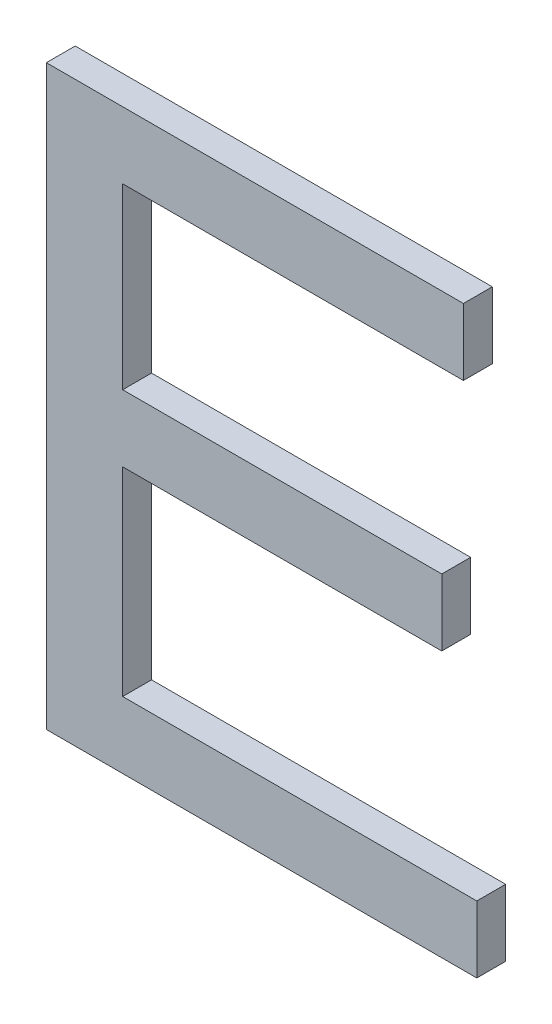
ISO-10303-21;
HEADER;
FILE_DESCRIPTION(('STEP AP214'),'2;1');
FILE_NAME('part.step','',(''),(''),'','','');
FILE_SCHEMA(('AUTOMOTIVE_DESIGN { 1 0 10303 214 1 1 1 1 }'));
ENDSEC;
DATA;
#1=APPLICATION_CONTEXT('core data for automotive mechanical design processes');
#2=APPLICATION_PROTOCOL_DEFINITION('international standard','automotive_design',2000,#1);
#3=PRODUCT_CONTEXT('',#1,'mechanical');
#4=PRODUCT('Part','Part','',(#3));
#5=PRODUCT_RELATED_PRODUCT_CATEGORY('part','',(#4));
#6=PRODUCT_DEFINITION_FORMATION('','',#4);
#7=PRODUCT_DEFINITION_CONTEXT('part definition',#1,'design');
#8=PRODUCT_DEFINITION('design','',#6,#7);
#9=PRODUCT_DEFINITION_SHAPE('','',#8);
#10=(LENGTH_UNIT() NAMED_UNIT(*) SI_UNIT(.MILLI.,.METRE.));
#11=(NAMED_UNIT(*) PLANE_ANGLE_UNIT() SI_UNIT($,.RADIAN.));
#12=(NAMED_UNIT(*) SI_UNIT($,.STERADIAN.) SOLID_ANGLE_UNIT());
#13=UNCERTAINTY_MEASURE_WITH_UNIT(LENGTH_MEASURE(1.E-05),#10,'distance_accuracy_value','');
#14=(GEOMETRIC_REPRESENTATION_CONTEXT(3) GLOBAL_UNCERTAINTY_ASSIGNED_CONTEXT((#13)) GLOBAL_UNIT_ASSIGNED_CONTEXT((#10,
#11,#12)) REPRESENTATION_CONTEXT('',''));
#15=CARTESIAN_POINT('',(0.,0.,0.));
#16=DIRECTION('',(0.,0.,1.));
#17=DIRECTION('',(1.,0.,0.));
#18=AXIS2_PLACEMENT_3D('',#15,#16,#17);
#19=CARTESIAN_POINT('',(0.319625251833,0.499859494143,0.05));
#20=DIRECTION('',(0.,0.,1.));
#21=DIRECTION('',(1.,0.,0.));
#22=AXIS2_PLACEMENT_3D('',#19,#20,#21);
#23=PLANE('',#22);
#24=DIRECTION('',(0.,1.,0.));
#25=VECTOR('',#24,1.);
#26=CARTESIAN_POINT('',(0.,0.,0.05));
#27=LINE('',#26,#25);
#28=CARTESIAN_POINT('',(0.,0.,0.05));
#29=VERTEX_POINT('',#28);
#30=CARTESIAN_POINT('',(0.,1.,0.05));
#31=VERTEX_POINT('',#30);
#32=EDGE_CURVE('E21',#29,#31,#27,.T.);
#33=ORIENTED_EDGE('',*,*,#32,.F.);
#34=DIRECTION('',(-1.,0.,0.));
#35=VECTOR('',#34,1.);
#36=CARTESIAN_POINT('',(0.745367005814,0.,0.05));
#37=LINE('',#36,#35);
#38=CARTESIAN_POINT('',(0.745367005814,0.,0.05));
#39=VERTEX_POINT('',#38);
#40=EDGE_CURVE('E190',#39,#29,#37,.T.);
#41=ORIENTED_EDGE('',*,*,#40,.F.);
#42=DIRECTION('',(0.,-1.,0.));
#43=VECTOR('',#42,1.);
#44=CARTESIAN_POINT('',(0.745367005814,0.115552325581,0.05));
#45=LINE('',#44,#43);
#46=CARTESIAN_POINT('',(0.745367005814,0.115552325581,0.05));
#47=VERTEX_POINT('',#46);
#48=EDGE_CURVE('E177',#47,#39,#45,.T.);
#49=ORIENTED_EDGE('',*,*,#48,.F.);
#50=DIRECTION('',(1.,0.,0.));
#51=VECTOR('',#50,1.);
#52=CARTESIAN_POINT('',(0.132176598837,0.115552325581,0.05));
#53=LINE('',#52,#51);
#54=CARTESIAN_POINT('',(0.132176598837,0.115552325581,0.05));
#55=VERTEX_POINT('',#54);
#56=EDGE_CURVE('E166',#55,#47,#53,.T.);
#57=ORIENTED_EDGE('',*,*,#56,.F.);
#58=DIRECTION('',(0.,-1.,0.));
#59=VECTOR('',#58,1.);
#60=CARTESIAN_POINT('',(0.132176598837,0.460029069767,0.05));
#61=LINE('',#60,#59);
#62=CARTESIAN_POINT('',(0.132176598837,0.460029069767,0.05));
#63=VERTEX_POINT('',#62);
#64=EDGE_CURVE('E198',#63,#55,#61,.T.);
#65=ORIENTED_EDGE('',*,*,#64,.F.);
#66=DIRECTION('',(-1.,0.,0.));
#67=VECTOR('',#66,1.);
#68=CARTESIAN_POINT('',(0.684729287791,0.460029069767,0.05));
#69=LINE('',#68,#67);
#70=CARTESIAN_POINT('',(0.684729287791,0.460029069767,0.05));
#71=VERTEX_POINT('',#70);
#72=EDGE_CURVE('E197',#71,#63,#69,.T.);
#73=ORIENTED_EDGE('',*,*,#72,.F.);
#74=DIRECTION('',(0.,-1.,0.));
#75=VECTOR('',#74,1.);
#76=CARTESIAN_POINT('',(0.684729287791,0.575581395349,0.05));
#77=LINE('',#76,#75);
#78=CARTESIAN_POINT('',(0.684729287791,0.575581395349,0.05));
#79=VERTEX_POINT('',#78);
#80=EDGE_CURVE('E131',#79,#71,#77,.T.);
#81=ORIENTED_EDGE('',*,*,#80,.F.);
#82=DIRECTION('',(1.,0.,0.));
#83=VECTOR('',#82,1.);
#84=CARTESIAN_POINT('',(0.132176598837,0.575581395349,0.05));
#85=LINE('',#84,#83);
#86=CARTESIAN_POINT('',(0.132176598837,0.575581395349,0.05));
#87=VERTEX_POINT('',#86);
#88=EDGE_CURVE('E206',#87,#79,#85,.T.);
#89=ORIENTED_EDGE('',*,*,#88,.F.);
#90=DIRECTION('',(0.,-1.,0.));
#91=VECTOR('',#90,1.);
#92=CARTESIAN_POINT('',(0.132176598837,0.884447674419,0.05));
#93=LINE('',#92,#91);
#94=CARTESIAN_POINT('',(0.132176598837,0.884447674419,0.05));
#95=VERTEX_POINT('',#94);
#96=EDGE_CURVE('E211',#95,#87,#93,.T.);
#97=ORIENTED_EDGE('',*,*,#96,.F.);
#98=DIRECTION('',(-1.,0.,0.));
#99=VECTOR('',#98,1.);
#100=CARTESIAN_POINT('',(0.722202034884,0.884447674419,0.05));
#101=LINE('',#100,#99);
#102=CARTESIAN_POINT('',(0.722202034884,0.884447674419,0.05));
#103=VERTEX_POINT('',#102);
#104=EDGE_CURVE('E93',#103,#95,#101,.T.);
#105=ORIENTED_EDGE('',*,*,#104,.F.);
#106=DIRECTION('',(0.,-1.,0.));
#107=VECTOR('',#106,1.);
#108=CARTESIAN_POINT('',(0.722202034884,1.,0.05));
#109=LINE('',#108,#107);
#110=CARTESIAN_POINT('',(0.722202034884,1.,0.05));
#111=VERTEX_POINT('',#110);
#112=EDGE_CURVE('E249',#111,#103,#109,.T.);
#113=ORIENTED_EDGE('',*,*,#112,.F.);
#114=DIRECTION('',(1.,0.,0.));
#115=VECTOR('',#114,1.);
#116=CARTESIAN_POINT('',(0.,1.,0.05));
#117=LINE('',#116,#115);
#118=EDGE_CURVE('E28',#31,#111,#117,.T.);
#119=ORIENTED_EDGE('',*,*,#118,.F.);
#120=EDGE_LOOP('',(#33,#41,#49,#57,#65,#73,#81,#89,#97,#105,#113,#119));
#121=FACE_BOUND('',#120,.T.);
#122=ADVANCED_FACE('F17',(#121),#23,.T.);
#123=CARTESIAN_POINT('',(0.319625251833,0.499859494143,0.));
#124=DIRECTION('',(0.,0.,1.));
#125=DIRECTION('',(1.,0.,0.));
#126=AXIS2_PLACEMENT_3D('',#123,#124,#125);
#127=PLANE('',#126);
#128=DIRECTION('',(1.,0.,0.));
#129=VECTOR('',#128,1.);
#130=CARTESIAN_POINT('',(0.,1.,0.));
#131=LINE('',#130,#129);
#132=CARTESIAN_POINT('',(0.,1.,0.));
#133=VERTEX_POINT('',#132);
#134=CARTESIAN_POINT('',(0.722202034884,1.,0.));
#135=VERTEX_POINT('',#134);
#136=EDGE_CURVE('E11',#133,#135,#131,.T.);
#137=ORIENTED_EDGE('',*,*,#136,.T.);
#138=DIRECTION('',(0.,-1.,0.));
#139=VECTOR('',#138,1.);
#140=CARTESIAN_POINT('',(0.722202034884,1.,0.));
#141=LINE('',#140,#139);
#142=CARTESIAN_POINT('',(0.722202034884,0.884447674419,0.));
#143=VERTEX_POINT('',#142);
#144=EDGE_CURVE('E259',#135,#143,#141,.T.);
#145=ORIENTED_EDGE('',*,*,#144,.T.);
#146=DIRECTION('',(-1.,0.,0.));
#147=VECTOR('',#146,1.);
#148=CARTESIAN_POINT('',(0.722202034884,0.884447674419,0.));
#149=LINE('',#148,#147);
#150=CARTESIAN_POINT('',(0.132176598837,0.884447674419,0.));
#151=VERTEX_POINT('',#150);
#152=EDGE_CURVE('E107',#143,#151,#149,.T.);
#153=ORIENTED_EDGE('',*,*,#152,.T.);
#154=DIRECTION('',(0.,-1.,0.));
#155=VECTOR('',#154,1.);
#156=CARTESIAN_POINT('',(0.132176598837,0.884447674419,0.));
#157=LINE('',#156,#155);
#158=CARTESIAN_POINT('',(0.132176598837,0.575581395349,0.));
#159=VERTEX_POINT('',#158);
#160=EDGE_CURVE('E208',#151,#159,#157,.T.);
#161=ORIENTED_EDGE('',*,*,#160,.T.);
#162=DIRECTION('',(1.,0.,0.));
#163=VECTOR('',#162,1.);
#164=CARTESIAN_POINT('',(0.132176598837,0.575581395349,0.));
#165=LINE('',#164,#163);
#166=CARTESIAN_POINT('',(0.684729287791,0.575581395349,0.));
#167=VERTEX_POINT('',#166);
#168=EDGE_CURVE('E120',#159,#167,#165,.T.);
#169=ORIENTED_EDGE('',*,*,#168,.T.);
#170=DIRECTION('',(0.,-1.,0.));
#171=VECTOR('',#170,1.);
#172=CARTESIAN_POINT('',(0.684729287791,0.575581395349,0.));
#173=LINE('',#172,#171);
#174=CARTESIAN_POINT('',(0.684729287791,0.460029069767,0.));
#175=VERTEX_POINT('',#174);
#176=EDGE_CURVE('E207',#167,#175,#173,.T.);
#177=ORIENTED_EDGE('',*,*,#176,.T.);
#178=DIRECTION('',(-1.,0.,0.));
#179=VECTOR('',#178,1.);
#180=CARTESIAN_POINT('',(0.684729287791,0.460029069767,0.));
#181=LINE('',#180,#179);
#182=CARTESIAN_POINT('',(0.132176598837,0.460029069767,0.));
#183=VERTEX_POINT('',#182);
#184=EDGE_CURVE('E235',#175,#183,#181,.T.);
#185=ORIENTED_EDGE('',*,*,#184,.T.);
#186=DIRECTION('',(0.,-1.,0.));
#187=VECTOR('',#186,1.);
#188=CARTESIAN_POINT('',(0.132176598837,0.460029069767,0.));
#189=LINE('',#188,#187);
#190=CARTESIAN_POINT('',(0.132176598837,0.115552325581,0.));
#191=VERTEX_POINT('',#190);
#192=EDGE_CURVE('E159',#183,#191,#189,.T.);
#193=ORIENTED_EDGE('',*,*,#192,.T.);
#194=DIRECTION('',(1.,0.,0.));
#195=VECTOR('',#194,1.);
#196=CARTESIAN_POINT('',(0.132176598837,0.115552325581,0.));
#197=LINE('',#196,#195);
#198=CARTESIAN_POINT('',(0.745367005814,0.115552325581,0.));
#199=VERTEX_POINT('',#198);
#200=EDGE_CURVE('E153',#191,#199,#197,.T.);
#201=ORIENTED_EDGE('',*,*,#200,.T.);
#202=DIRECTION('',(0.,-1.,0.));
#203=VECTOR('',#202,1.);
#204=CARTESIAN_POINT('',(0.745367005814,0.115552325581,0.));
#205=LINE('',#204,#203);
#206=CARTESIAN_POINT('',(0.745367005814,0.,0.));
#207=VERTEX_POINT('',#206);
#208=EDGE_CURVE('E156',#199,#207,#205,.T.);
#209=ORIENTED_EDGE('',*,*,#208,.T.);
#210=DIRECTION('',(-1.,0.,0.));
#211=VECTOR('',#210,1.);
#212=CARTESIAN_POINT('',(0.745367005814,0.,0.));
#213=LINE('',#212,#211);
#214=CARTESIAN_POINT('',(0.,0.,0.));
#215=VERTEX_POINT('',#214);
#216=EDGE_CURVE('E183',#207,#215,#213,.T.);
#217=ORIENTED_EDGE('',*,*,#216,.T.);
#218=DIRECTION('',(0.,1.,0.));
#219=VECTOR('',#218,1.);
#220=CARTESIAN_POINT('',(0.,0.,0.));
#221=LINE('',#220,#219);
#222=EDGE_CURVE('E229',#215,#133,#221,.T.);
#223=ORIENTED_EDGE('',*,*,#222,.T.);
#224=EDGE_LOOP('',(#137,#145,#153,#161,#169,#177,#185,#193,#201,#209,#217,#223));
#225=FACE_BOUND('',#224,.T.);
#226=ADVANCED_FACE('F155',(#225),#127,.F.);
#227=CARTESIAN_POINT('',(0.,1.,0.));
#228=DIRECTION('',(0.,1.,0.));
#229=DIRECTION('',(1.,0.,0.));
#230=AXIS2_PLACEMENT_3D('',#227,#228,#229);
#231=PLANE('',#230);
#232=DIRECTION('',(0.,0.,1.));
#233=VECTOR('',#232,1.);
#234=CARTESIAN_POINT('',(0.,1.,0.));
#235=LINE('',#234,#233);
#236=EDGE_CURVE('E232',#133,#31,#235,.T.);
#237=ORIENTED_EDGE('',*,*,#236,.T.);
#238=ORIENTED_EDGE('',*,*,#118,.T.);
#239=DIRECTION('',(0.,0.,1.));
#240=VECTOR('',#239,1.);
#241=CARTESIAN_POINT('',(0.722202034884,1.,0.));
#242=LINE('',#241,#240);
#243=EDGE_CURVE('E245',#135,#111,#242,.T.);
#244=ORIENTED_EDGE('',*,*,#243,.F.);
#245=ORIENTED_EDGE('',*,*,#136,.F.);
#246=EDGE_LOOP('',(#237,#238,#244,#245));
#247=FACE_BOUND('',#246,.T.);
#248=ADVANCED_FACE('F313',(#247),#231,.T.);
#249=CARTESIAN_POINT('',(0.722202034884,1.,0.));
#250=DIRECTION('',(1.,0.,0.));
#251=DIRECTION('',(0.,1.,0.));
#252=AXIS2_PLACEMENT_3D('',#249,#250,#251);
#253=PLANE('',#252);
#254=ORIENTED_EDGE('',*,*,#243,.T.);
#255=ORIENTED_EDGE('',*,*,#112,.T.);
#256=DIRECTION('',(0.,0.,1.));
#257=VECTOR('',#256,1.);
#258=CARTESIAN_POINT('',(0.722202034884,0.884447674419,0.));
#259=LINE('',#258,#257);
#260=EDGE_CURVE('E210',#143,#103,#259,.T.);
#261=ORIENTED_EDGE('',*,*,#260,.F.);
#262=ORIENTED_EDGE('',*,*,#144,.F.);
#263=EDGE_LOOP('',(#254,#255,#261,#262));
#264=FACE_BOUND('',#263,.T.);
#265=ADVANCED_FACE('F319',(#264),#253,.T.);
#266=CARTESIAN_POINT('',(0.722202034884,0.884447674419,0.));
#267=DIRECTION('',(0.,-1.,0.));
#268=DIRECTION('',(0.,0.,-1.));
#269=AXIS2_PLACEMENT_3D('',#266,#267,#268);
#270=PLANE('',#269);
#271=ORIENTED_EDGE('',*,*,#260,.T.);
#272=ORIENTED_EDGE('',*,*,#104,.T.);
#273=DIRECTION('',(0.,0.,1.));
#274=VECTOR('',#273,1.);
#275=CARTESIAN_POINT('',(0.132176598837,0.884447674419,0.));
#276=LINE('',#275,#274);
#277=EDGE_CURVE('E217',#151,#95,#276,.T.);
#278=ORIENTED_EDGE('',*,*,#277,.F.);
#279=ORIENTED_EDGE('',*,*,#152,.F.);
#280=EDGE_LOOP('',(#271,#272,#278,#279));
#281=FACE_BOUND('',#280,.T.);
#282=ADVANCED_FACE('F320',(#281),#270,.T.);
#283=CARTESIAN_POINT('',(0.132176598837,0.884447674419,0.));
#284=DIRECTION('',(1.,0.,0.));
#285=DIRECTION('',(0.,1.,0.));
#286=AXIS2_PLACEMENT_3D('',#283,#284,#285);
#287=PLANE('',#286);
#288=ORIENTED_EDGE('',*,*,#277,.T.);
#289=ORIENTED_EDGE('',*,*,#96,.T.);
#290=DIRECTION('',(0.,0.,1.));
#291=VECTOR('',#290,1.);
#292=CARTESIAN_POINT('',(0.132176598837,0.575581395349,0.));
#293=LINE('',#292,#291);
#294=EDGE_CURVE('E203',#159,#87,#293,.T.);
#295=ORIENTED_EDGE('',*,*,#294,.F.);
#296=ORIENTED_EDGE('',*,*,#160,.F.);
#297=EDGE_LOOP('',(#288,#289,#295,#296));
#298=FACE_BOUND('',#297,.T.);
#299=ADVANCED_FACE('F341',(#298),#287,.T.);
#300=CARTESIAN_POINT('',(0.132176598837,0.575581395349,0.));
#301=DIRECTION('',(0.,1.,0.));
#302=DIRECTION('',(1.,0.,0.));
#303=AXIS2_PLACEMENT_3D('',#300,#301,#302);
#304=PLANE('',#303);
#305=ORIENTED_EDGE('',*,*,#294,.T.);
#306=ORIENTED_EDGE('',*,*,#88,.T.);
#307=DIRECTION('',(0.,0.,1.));
#308=VECTOR('',#307,1.);
#309=CARTESIAN_POINT('',(0.684729287791,0.575581395349,0.));
#310=LINE('',#309,#308);
#311=EDGE_CURVE('E233',#167,#79,#310,.T.);
#312=ORIENTED_EDGE('',*,*,#311,.F.);
#313=ORIENTED_EDGE('',*,*,#168,.F.);
#314=EDGE_LOOP('',(#305,#306,#312,#313));
#315=FACE_BOUND('',#314,.T.);
#316=ADVANCED_FACE('F333',(#315),#304,.T.);
#317=CARTESIAN_POINT('',(0.684729287791,0.575581395349,0.));
#318=DIRECTION('',(1.,0.,0.));
#319=DIRECTION('',(0.,1.,0.));
#320=AXIS2_PLACEMENT_3D('',#317,#318,#319);
#321=PLANE('',#320);
#322=ORIENTED_EDGE('',*,*,#311,.T.);
#323=ORIENTED_EDGE('',*,*,#80,.T.);
#324=DIRECTION('',(0.,0.,1.));
#325=VECTOR('',#324,1.);
#326=CARTESIAN_POINT('',(0.684729287791,0.460029069767,0.));
#327=LINE('',#326,#325);
#328=EDGE_CURVE('E194',#175,#71,#327,.T.);
#329=ORIENTED_EDGE('',*,*,#328,.F.);
#330=ORIENTED_EDGE('',*,*,#176,.F.);
#331=EDGE_LOOP('',(#322,#323,#329,#330));
#332=FACE_BOUND('',#331,.T.);
#333=ADVANCED_FACE('F331',(#332),#321,.T.);
#334=CARTESIAN_POINT('',(0.684729287791,0.460029069767,0.));
#335=DIRECTION('',(0.,-1.,0.));
#336=DIRECTION('',(0.,0.,-1.));
#337=AXIS2_PLACEMENT_3D('',#334,#335,#336);
#338=PLANE('',#337);
#339=ORIENTED_EDGE('',*,*,#328,.T.);
#340=ORIENTED_EDGE('',*,*,#72,.T.);
#341=DIRECTION('',(0.,0.,1.));
#342=VECTOR('',#341,1.);
#343=CARTESIAN_POINT('',(0.132176598837,0.460029069767,0.));
#344=LINE('',#343,#342);
#345=EDGE_CURVE('E165',#183,#63,#344,.T.);
#346=ORIENTED_EDGE('',*,*,#345,.F.);
#347=ORIENTED_EDGE('',*,*,#184,.F.);
#348=EDGE_LOOP('',(#339,#340,#346,#347));
#349=FACE_BOUND('',#348,.T.);
#350=ADVANCED_FACE('F330',(#349),#338,.T.);
#351=CARTESIAN_POINT('',(0.132176598837,0.460029069767,0.));
#352=DIRECTION('',(1.,0.,0.));
#353=DIRECTION('',(0.,1.,0.));
#354=AXIS2_PLACEMENT_3D('',#351,#352,#353);
#355=PLANE('',#354);
#356=ORIENTED_EDGE('',*,*,#345,.T.);
#357=ORIENTED_EDGE('',*,*,#64,.T.);
#358=DIRECTION('',(0.,0.,1.));
#359=VECTOR('',#358,1.);
#360=CARTESIAN_POINT('',(0.132176598837,0.115552325581,0.));
#361=LINE('',#360,#359);
#362=EDGE_CURVE('E176',#191,#55,#361,.T.);
#363=ORIENTED_EDGE('',*,*,#362,.F.);
#364=ORIENTED_EDGE('',*,*,#192,.F.);
#365=EDGE_LOOP('',(#356,#357,#363,#364));
#366=FACE_BOUND('',#365,.T.);
#367=ADVANCED_FACE('F19',(#366),#355,.T.);
#368=CARTESIAN_POINT('',(0.132176598837,0.115552325581,0.));
#369=DIRECTION('',(0.,1.,0.));
#370=DIRECTION('',(1.,0.,0.));
#371=AXIS2_PLACEMENT_3D('',#368,#369,#370);
#372=PLANE('',#371);
#373=ORIENTED_EDGE('',*,*,#362,.T.);
#374=ORIENTED_EDGE('',*,*,#56,.T.);
#375=DIRECTION('',(0.,0.,1.));
#376=VECTOR('',#375,1.);
#377=CARTESIAN_POINT('',(0.745367005814,0.115552325581,0.));
#378=LINE('',#377,#376);
#379=EDGE_CURVE('E172',#199,#47,#378,.T.);
#380=ORIENTED_EDGE('',*,*,#379,.F.);
#381=ORIENTED_EDGE('',*,*,#200,.F.);
#382=EDGE_LOOP('',(#373,#374,#380,#381));
#383=FACE_BOUND('',#382,.T.);
#384=ADVANCED_FACE('F179',(#383),#372,.T.);
#385=CARTESIAN_POINT('',(0.745367005814,0.115552325581,0.));
#386=DIRECTION('',(1.,0.,0.));
#387=DIRECTION('',(0.,1.,0.));
#388=AXIS2_PLACEMENT_3D('',#385,#386,#387);
#389=PLANE('',#388);
#390=ORIENTED_EDGE('',*,*,#379,.T.);
#391=ORIENTED_EDGE('',*,*,#48,.T.);
#392=DIRECTION('',(0.,0.,1.));
#393=VECTOR('',#392,1.);
#394=CARTESIAN_POINT('',(0.745367005814,0.,0.));
#395=LINE('',#394,#393);
#396=EDGE_CURVE('E174',#207,#39,#395,.T.);
#397=ORIENTED_EDGE('',*,*,#396,.F.);
#398=ORIENTED_EDGE('',*,*,#208,.F.);
#399=EDGE_LOOP('',(#390,#391,#397,#398));
#400=FACE_BOUND('',#399,.T.);
#401=ADVANCED_FACE('F171',(#400),#389,.T.);
#402=CARTESIAN_POINT('',(0.745367005814,0.,0.));
#403=DIRECTION('',(0.,-1.,0.));
#404=DIRECTION('',(0.,0.,-1.));
#405=AXIS2_PLACEMENT_3D('',#402,#403,#404);
#406=PLANE('',#405);
#407=ORIENTED_EDGE('',*,*,#396,.T.);
#408=ORIENTED_EDGE('',*,*,#40,.T.);
#409=DIRECTION('',(0.,0.,1.));
#410=VECTOR('',#409,1.);
#411=CARTESIAN_POINT('',(0.,0.,0.));
#412=LINE('',#411,#410);
#413=EDGE_CURVE('E239',#215,#29,#412,.T.);
#414=ORIENTED_EDGE('',*,*,#413,.F.);
#415=ORIENTED_EDGE('',*,*,#216,.F.);
#416=EDGE_LOOP('',(#407,#408,#414,#415));
#417=FACE_BOUND('',#416,.T.);
#418=ADVANCED_FACE('F304',(#417),#406,.T.);
#419=CARTESIAN_POINT('',(0.,0.,0.));
#420=DIRECTION('',(-1.,0.,0.));
#421=DIRECTION('',(0.,0.,1.));
#422=AXIS2_PLACEMENT_3D('',#419,#420,#421);
#423=PLANE('',#422);
#424=ORIENTED_EDGE('',*,*,#413,.T.);
#425=ORIENTED_EDGE('',*,*,#32,.T.);
#426=ORIENTED_EDGE('',*,*,#236,.F.);
#427=ORIENTED_EDGE('',*,*,#222,.F.);
#428=EDGE_LOOP('',(#424,#425,#426,#427));
#429=FACE_BOUND('',#428,.T.);
#430=ADVANCED_FACE('F311',(#429),#423,.T.);
#431=CLOSED_SHELL('',(#122,#226,#248,#265,#282,#299,#316,#333,#350,#367,#384,#401,#418,#430));
#432=MANIFOLD_SOLID_BREP('B1',#431);
#433=ADVANCED_BREP_SHAPE_REPRESENTATION('',(#18,#432),#14);
#434=SHAPE_DEFINITION_REPRESENTATION(#9,#433);
ENDSEC;
END-ISO-10303-21;
